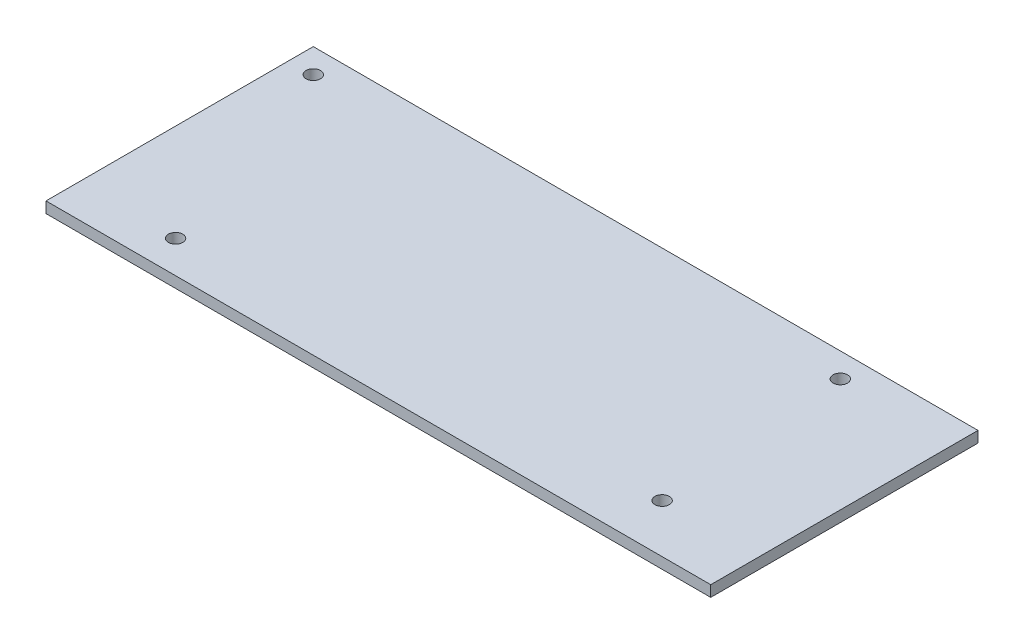
ISO-10303-21;
HEADER;
FILE_DESCRIPTION(('STEP AP214'),'2;1');
FILE_NAME('part.step','',(''),(''),'','','');
FILE_SCHEMA(('AUTOMOTIVE_DESIGN { 1 0 10303 214 1 1 1 1 }'));
ENDSEC;
DATA;
#1=APPLICATION_CONTEXT('core data for automotive mechanical design processes');
#2=APPLICATION_PROTOCOL_DEFINITION('international standard','automotive_design',2000,#1);
#3=PRODUCT_CONTEXT('',#1,'mechanical');
#4=PRODUCT('Part','Part','',(#3));
#5=PRODUCT_RELATED_PRODUCT_CATEGORY('part','',(#4));
#6=PRODUCT_DEFINITION_FORMATION('','',#4);
#7=PRODUCT_DEFINITION_CONTEXT('part definition',#1,'design');
#8=PRODUCT_DEFINITION('design','',#6,#7);
#9=PRODUCT_DEFINITION_SHAPE('','',#8);
#10=(LENGTH_UNIT() NAMED_UNIT(*) SI_UNIT(.MILLI.,.METRE.));
#11=(NAMED_UNIT(*) PLANE_ANGLE_UNIT() SI_UNIT($,.RADIAN.));
#12=(NAMED_UNIT(*) SI_UNIT($,.STERADIAN.) SOLID_ANGLE_UNIT());
#13=UNCERTAINTY_MEASURE_WITH_UNIT(LENGTH_MEASURE(1.E-05),#10,'distance_accuracy_value','');
#14=(GEOMETRIC_REPRESENTATION_CONTEXT(3) GLOBAL_UNCERTAINTY_ASSIGNED_CONTEXT((#13)) GLOBAL_UNIT_ASSIGNED_CONTEXT((#10,
#11,#12)) REPRESENTATION_CONTEXT('',''));
#15=CARTESIAN_POINT('',(0.,0.,0.));
#16=DIRECTION('',(0.,0.,1.));
#17=DIRECTION('',(1.,0.,0.));
#18=AXIS2_PLACEMENT_3D('',#15,#16,#17);
#19=CARTESIAN_POINT('',(52.1208,0.8636,-20.955));
#20=DIRECTION('',(-1.,0.,0.));
#21=DIRECTION('',(0.,0.,1.));
#22=AXIS2_PLACEMENT_3D('',#19,#20,#21);
#23=PLANE('',#22);
#24=DIRECTION('',(0.,0.,-1.));
#25=VECTOR('',#24,1.);
#26=CARTESIAN_POINT('',(52.1208,-0.8636,-20.955));
#27=LINE('',#26,#25);
#28=CARTESIAN_POINT('',(52.1208,-0.8636,20.955));
#29=VERTEX_POINT('',#28);
#30=CARTESIAN_POINT('',(52.1208,-0.8636,-20.955));
#31=VERTEX_POINT('',#30);
#32=EDGE_CURVE('E95',#29,#31,#27,.T.);
#33=ORIENTED_EDGE('',*,*,#32,.T.);
#34=DIRECTION('',(0.,-1.,0.));
#35=VECTOR('',#34,1.);
#36=CARTESIAN_POINT('',(52.1208,0.8636,-20.955));
#37=LINE('',#36,#35);
#38=CARTESIAN_POINT('',(52.1208,0.8636,-20.955));
#39=VERTEX_POINT('',#38);
#40=EDGE_CURVE('E11',#39,#31,#37,.T.);
#41=ORIENTED_EDGE('',*,*,#40,.F.);
#42=DIRECTION('',(0.,0.,-1.));
#43=VECTOR('',#42,1.);
#44=CARTESIAN_POINT('',(52.1208,0.8636,-20.955));
#45=LINE('',#44,#43);
#46=CARTESIAN_POINT('',(52.1208,0.8636,20.955));
#47=VERTEX_POINT('',#46);
#48=EDGE_CURVE('E83',#47,#39,#45,.T.);
#49=ORIENTED_EDGE('',*,*,#48,.F.);
#50=DIRECTION('',(0.,-1.,0.));
#51=VECTOR('',#50,1.);
#52=CARTESIAN_POINT('',(52.1208,0.8636,20.955));
#53=LINE('',#52,#51);
#54=EDGE_CURVE('E91',#47,#29,#53,.T.);
#55=ORIENTED_EDGE('',*,*,#54,.T.);
#56=EDGE_LOOP('',(#33,#41,#49,#55));
#57=FACE_BOUND('',#56,.T.);
#58=ADVANCED_FACE('F32',(#57),#23,.F.);
#59=CARTESIAN_POINT('',(-52.1208,0.8636,-20.955));
#60=DIRECTION('',(0.,0.,1.));
#61=DIRECTION('',(1.,0.,0.));
#62=AXIS2_PLACEMENT_3D('',#59,#60,#61);
#63=PLANE('',#62);
#64=DIRECTION('',(-1.,0.,0.));
#65=VECTOR('',#64,1.);
#66=CARTESIAN_POINT('',(-52.1208,-0.8636,-20.955));
#67=LINE('',#66,#65);
#68=CARTESIAN_POINT('',(-52.1208,-0.8636,-20.955));
#69=VERTEX_POINT('',#68);
#70=EDGE_CURVE('E87',#31,#69,#67,.T.);
#71=ORIENTED_EDGE('',*,*,#70,.T.);
#72=DIRECTION('',(0.,-1.,0.));
#73=VECTOR('',#72,1.);
#74=CARTESIAN_POINT('',(-52.1208,0.8636,-20.955));
#75=LINE('',#74,#73);
#76=CARTESIAN_POINT('',(-52.1208,0.8636,-20.955));
#77=VERTEX_POINT('',#76);
#78=EDGE_CURVE('E40',#77,#69,#75,.T.);
#79=ORIENTED_EDGE('',*,*,#78,.F.);
#80=DIRECTION('',(-1.,0.,0.));
#81=VECTOR('',#80,1.);
#82=CARTESIAN_POINT('',(-52.1208,0.8636,-20.955));
#83=LINE('',#82,#81);
#84=EDGE_CURVE('E78',#39,#77,#83,.T.);
#85=ORIENTED_EDGE('',*,*,#84,.F.);
#86=ORIENTED_EDGE('',*,*,#40,.T.);
#87=EDGE_LOOP('',(#71,#79,#85,#86));
#88=FACE_BOUND('',#87,.T.);
#89=ADVANCED_FACE('F86',(#88),#63,.F.);
#90=CARTESIAN_POINT('',(-52.1208,0.8636,-20.955));
#91=DIRECTION('',(1.,0.,0.));
#92=DIRECTION('',(0.,0.,-1.));
#93=AXIS2_PLACEMENT_3D('',#90,#91,#92);
#94=PLANE('',#93);
#95=DIRECTION('',(0.,0.,1.));
#96=VECTOR('',#95,1.);
#97=CARTESIAN_POINT('',(-52.1208,-0.8636,-20.955));
#98=LINE('',#97,#96);
#99=CARTESIAN_POINT('',(-52.1208,-0.8636,20.955));
#100=VERTEX_POINT('',#99);
#101=EDGE_CURVE('E65',#69,#100,#98,.T.);
#102=ORIENTED_EDGE('',*,*,#101,.T.);
#103=DIRECTION('',(0.,-1.,0.));
#104=VECTOR('',#103,1.);
#105=CARTESIAN_POINT('',(-52.1208,0.8636,20.955));
#106=LINE('',#105,#104);
#107=CARTESIAN_POINT('',(-52.1208,0.8636,20.955));
#108=VERTEX_POINT('',#107);
#109=EDGE_CURVE('E88',#108,#100,#106,.T.);
#110=ORIENTED_EDGE('',*,*,#109,.F.);
#111=DIRECTION('',(0.,0.,1.));
#112=VECTOR('',#111,1.);
#113=CARTESIAN_POINT('',(-52.1208,0.8636,-20.955));
#114=LINE('',#113,#112);
#115=EDGE_CURVE('E81',#77,#108,#114,.T.);
#116=ORIENTED_EDGE('',*,*,#115,.F.);
#117=ORIENTED_EDGE('',*,*,#78,.T.);
#118=EDGE_LOOP('',(#102,#110,#116,#117));
#119=FACE_BOUND('',#118,.T.);
#120=ADVANCED_FACE('F89',(#119),#94,.F.);
#121=CARTESIAN_POINT('',(-52.1208,0.8636,20.955));
#122=DIRECTION('',(0.,0.,-1.));
#123=DIRECTION('',(-1.,0.,0.));
#124=AXIS2_PLACEMENT_3D('',#121,#122,#123);
#125=PLANE('',#124);
#126=DIRECTION('',(1.,0.,0.));
#127=VECTOR('',#126,1.);
#128=CARTESIAN_POINT('',(-52.1208,-0.8636,20.955));
#129=LINE('',#128,#127);
#130=EDGE_CURVE('E71',#100,#29,#129,.T.);
#131=ORIENTED_EDGE('',*,*,#130,.T.);
#132=ORIENTED_EDGE('',*,*,#54,.F.);
#133=DIRECTION('',(1.,0.,0.));
#134=VECTOR('',#133,1.);
#135=CARTESIAN_POINT('',(-52.1208,0.8636,20.955));
#136=LINE('',#135,#134);
#137=EDGE_CURVE('E48',#108,#47,#136,.T.);
#138=ORIENTED_EDGE('',*,*,#137,.F.);
#139=ORIENTED_EDGE('',*,*,#109,.T.);
#140=EDGE_LOOP('',(#131,#132,#138,#139));
#141=FACE_BOUND('',#140,.T.);
#142=ADVANCED_FACE('F103',(#141),#125,.F.);
#143=CARTESIAN_POINT('',(0.,0.8636,0.));
#144=DIRECTION('',(0.,1.,0.));
#145=DIRECTION('',(0.,0.,1.));
#146=AXIS2_PLACEMENT_3D('',#143,#144,#145);
#147=PLANE('',#146);
#148=CARTESIAN_POINT('',(-48.3108,0.8636,-17.145));
#149=DIRECTION('',(0.,1.,0.));
#150=DIRECTION('',(0.,0.,1.));
#151=AXIS2_PLACEMENT_3D('',#148,#149,#150);
#152=CIRCLE('',#151,1.1303);
#153=CARTESIAN_POINT('',(-48.3108,0.8636,-16.0147));
#154=VERTEX_POINT('',#153);
#155=EDGE_CURVE('E129',#154,#154,#152,.T.);
#156=ORIENTED_EDGE('',*,*,#155,.F.);
#157=EDGE_LOOP('',(#156));
#158=FACE_BOUND('',#157,.T.);
#159=CARTESIAN_POINT('',(-36.8808,0.8636,15.875));
#160=DIRECTION('',(0.,1.,0.));
#161=DIRECTION('',(0.,0.,1.));
#162=AXIS2_PLACEMENT_3D('',#159,#160,#161);
#163=CIRCLE('',#162,1.1303);
#164=CARTESIAN_POINT('',(-36.8808,0.8636,17.0053));
#165=VERTEX_POINT('',#164);
#166=EDGE_CURVE('E123',#165,#165,#163,.T.);
#167=ORIENTED_EDGE('',*,*,#166,.F.);
#168=EDGE_LOOP('',(#167));
#169=FACE_BOUND('',#168,.T.);
#170=CARTESIAN_POINT('',(34.3408,0.8636,-17.145));
#171=DIRECTION('',(0.,1.,0.));
#172=DIRECTION('',(0.,0.,1.));
#173=AXIS2_PLACEMENT_3D('',#170,#171,#172);
#174=CIRCLE('',#173,1.1303);
#175=CARTESIAN_POINT('',(34.3408,0.8636,-16.0147));
#176=VERTEX_POINT('',#175);
#177=EDGE_CURVE('E117',#176,#176,#174,.T.);
#178=ORIENTED_EDGE('',*,*,#177,.F.);
#179=EDGE_LOOP('',(#178));
#180=FACE_BOUND('',#179,.T.);
#181=CARTESIAN_POINT('',(36.8808,0.8636,13.335));
#182=DIRECTION('',(0.,1.,0.));
#183=DIRECTION('',(0.,0.,1.));
#184=AXIS2_PLACEMENT_3D('',#181,#182,#183);
#185=CIRCLE('',#184,1.1303);
#186=CARTESIAN_POINT('',(36.8808,0.8636,14.4653));
#187=VERTEX_POINT('',#186);
#188=EDGE_CURVE('E111',#187,#187,#185,.T.);
#189=ORIENTED_EDGE('',*,*,#188,.F.);
#190=EDGE_LOOP('',(#189));
#191=FACE_BOUND('',#190,.T.);
#192=ORIENTED_EDGE('',*,*,#48,.T.);
#193=ORIENTED_EDGE('',*,*,#84,.T.);
#194=ORIENTED_EDGE('',*,*,#115,.T.);
#195=ORIENTED_EDGE('',*,*,#137,.T.);
#196=EDGE_LOOP('',(#192,#193,#194,#195));
#197=FACE_BOUND('',#196,.T.);
#198=ADVANCED_FACE('F79',(#158,#169,#180,#191,#197),#147,.T.);
#199=CARTESIAN_POINT('',(0.,-0.8636,0.));
#200=DIRECTION('',(0.,1.,0.));
#201=DIRECTION('',(0.,0.,1.));
#202=AXIS2_PLACEMENT_3D('',#199,#200,#201);
#203=PLANE('',#202);
#204=CARTESIAN_POINT('',(-48.3108,-0.8636,-17.145));
#205=DIRECTION('',(0.,1.,0.));
#206=DIRECTION('',(0.,0.,1.));
#207=AXIS2_PLACEMENT_3D('',#204,#205,#206);
#208=CIRCLE('',#207,1.1303);
#209=CARTESIAN_POINT('',(-48.3108,-0.8636,-16.0147));
#210=VERTEX_POINT('',#209);
#211=EDGE_CURVE('E126',#210,#210,#208,.T.);
#212=ORIENTED_EDGE('',*,*,#211,.T.);
#213=EDGE_LOOP('',(#212));
#214=FACE_BOUND('',#213,.T.);
#215=CARTESIAN_POINT('',(-36.8808,-0.8636,15.875));
#216=DIRECTION('',(0.,1.,0.));
#217=DIRECTION('',(0.,0.,1.));
#218=AXIS2_PLACEMENT_3D('',#215,#216,#217);
#219=CIRCLE('',#218,1.1303);
#220=CARTESIAN_POINT('',(-36.8808,-0.8636,17.0053));
#221=VERTEX_POINT('',#220);
#222=EDGE_CURVE('E120',#221,#221,#219,.T.);
#223=ORIENTED_EDGE('',*,*,#222,.T.);
#224=EDGE_LOOP('',(#223));
#225=FACE_BOUND('',#224,.T.);
#226=CARTESIAN_POINT('',(34.3408,-0.8636,-17.145));
#227=DIRECTION('',(0.,1.,0.));
#228=DIRECTION('',(0.,0.,1.));
#229=AXIS2_PLACEMENT_3D('',#226,#227,#228);
#230=CIRCLE('',#229,1.1303);
#231=CARTESIAN_POINT('',(34.3408,-0.8636,-16.0147));
#232=VERTEX_POINT('',#231);
#233=EDGE_CURVE('E114',#232,#232,#230,.T.);
#234=ORIENTED_EDGE('',*,*,#233,.T.);
#235=EDGE_LOOP('',(#234));
#236=FACE_BOUND('',#235,.T.);
#237=CARTESIAN_POINT('',(36.8808,-0.8636,13.335));
#238=DIRECTION('',(0.,1.,0.));
#239=DIRECTION('',(0.,0.,1.));
#240=AXIS2_PLACEMENT_3D('',#237,#238,#239);
#241=CIRCLE('',#240,1.1303);
#242=CARTESIAN_POINT('',(36.8808,-0.8636,14.4653));
#243=VERTEX_POINT('',#242);
#244=EDGE_CURVE('E98',#243,#243,#241,.T.);
#245=ORIENTED_EDGE('',*,*,#244,.T.);
#246=EDGE_LOOP('',(#245));
#247=FACE_BOUND('',#246,.T.);
#248=ORIENTED_EDGE('',*,*,#32,.F.);
#249=ORIENTED_EDGE('',*,*,#130,.F.);
#250=ORIENTED_EDGE('',*,*,#101,.F.);
#251=ORIENTED_EDGE('',*,*,#70,.F.);
#252=EDGE_LOOP('',(#248,#249,#250,#251));
#253=FACE_BOUND('',#252,.T.);
#254=ADVANCED_FACE('F106',(#214,#225,#236,#247,#253),#203,.F.);
#255=CARTESIAN_POINT('',(36.8808,0.8636,13.335));
#256=DIRECTION('',(0.,1.,0.));
#257=DIRECTION('',(0.,0.,1.));
#258=AXIS2_PLACEMENT_3D('',#255,#256,#257);
#259=CYLINDRICAL_SURFACE('',#258,1.1303);
#260=ORIENTED_EDGE('',*,*,#244,.F.);
#261=EDGE_LOOP('',(#260));
#262=FACE_BOUND('',#261,.T.);
#263=ORIENTED_EDGE('',*,*,#188,.T.);
#264=EDGE_LOOP('',(#263));
#265=FACE_BOUND('',#264,.T.);
#266=ADVANCED_FACE('F144',(#262,#265),#259,.F.);
#267=CARTESIAN_POINT('',(34.3408,0.8636,-17.145));
#268=DIRECTION('',(0.,1.,0.));
#269=DIRECTION('',(0.,0.,1.));
#270=AXIS2_PLACEMENT_3D('',#267,#268,#269);
#271=CYLINDRICAL_SURFACE('',#270,1.1303);
#272=ORIENTED_EDGE('',*,*,#233,.F.);
#273=EDGE_LOOP('',(#272));
#274=FACE_BOUND('',#273,.T.);
#275=ORIENTED_EDGE('',*,*,#177,.T.);
#276=EDGE_LOOP('',(#275));
#277=FACE_BOUND('',#276,.T.);
#278=ADVANCED_FACE('F146',(#274,#277),#271,.F.);
#279=CARTESIAN_POINT('',(-36.8808,0.8636,15.875));
#280=DIRECTION('',(0.,1.,0.));
#281=DIRECTION('',(0.,0.,1.));
#282=AXIS2_PLACEMENT_3D('',#279,#280,#281);
#283=CYLINDRICAL_SURFACE('',#282,1.1303);
#284=ORIENTED_EDGE('',*,*,#222,.F.);
#285=EDGE_LOOP('',(#284));
#286=FACE_BOUND('',#285,.T.);
#287=ORIENTED_EDGE('',*,*,#166,.T.);
#288=EDGE_LOOP('',(#287));
#289=FACE_BOUND('',#288,.T.);
#290=ADVANCED_FACE('F153',(#286,#289),#283,.F.);
#291=CARTESIAN_POINT('',(-48.3108,0.8636,-17.145));
#292=DIRECTION('',(0.,1.,0.));
#293=DIRECTION('',(0.,0.,1.));
#294=AXIS2_PLACEMENT_3D('',#291,#292,#293);
#295=CYLINDRICAL_SURFACE('',#294,1.1303);
#296=ORIENTED_EDGE('',*,*,#211,.F.);
#297=EDGE_LOOP('',(#296));
#298=FACE_BOUND('',#297,.T.);
#299=ORIENTED_EDGE('',*,*,#155,.T.);
#300=EDGE_LOOP('',(#299));
#301=FACE_BOUND('',#300,.T.);
#302=ADVANCED_FACE('F133',(#298,#301),#295,.F.);
#303=CLOSED_SHELL('',(#58,#89,#120,#142,#198,#254,#266,#278,#290,#302));
#304=MANIFOLD_SOLID_BREP('B2',#303);
#305=ADVANCED_BREP_SHAPE_REPRESENTATION('',(#18,#304),#14);
#306=SHAPE_DEFINITION_REPRESENTATION(#9,#305);
ENDSEC;
END-ISO-10303-21;
